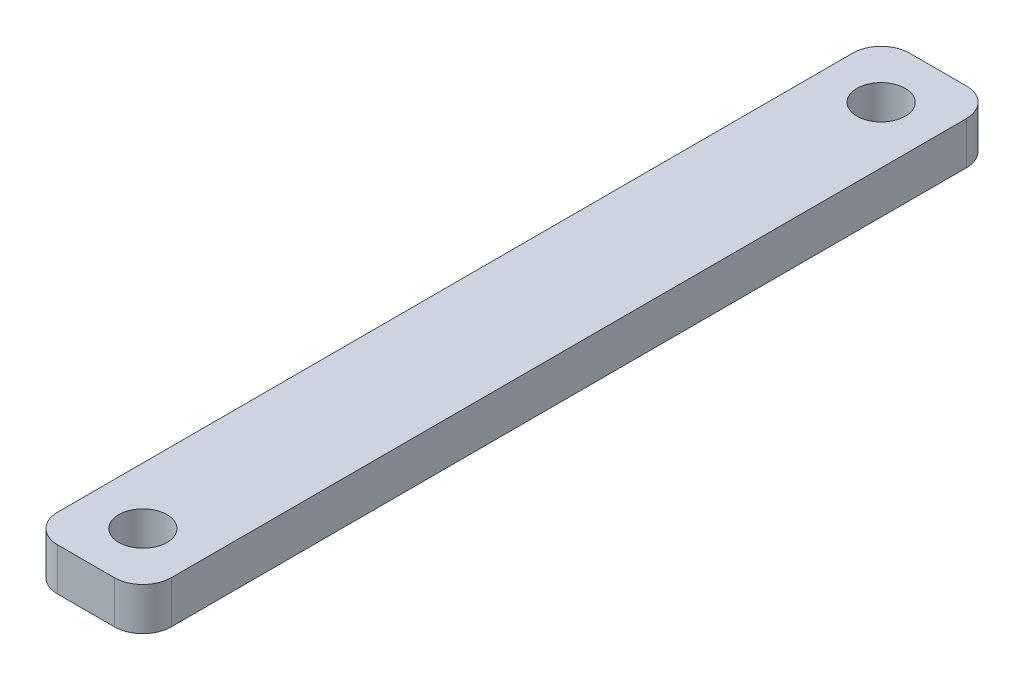
ISO-10303-21;
HEADER;
FILE_DESCRIPTION(('STEP AP214'),'2;1');
FILE_NAME('part.step','',(''),(''),'','','');
FILE_SCHEMA(('AUTOMOTIVE_DESIGN { 1 0 10303 214 1 1 1 1 }'));
ENDSEC;
DATA;
#1=APPLICATION_CONTEXT('core data for automotive mechanical design processes');
#2=APPLICATION_PROTOCOL_DEFINITION('international standard','automotive_design',2000,#1);
#3=PRODUCT_CONTEXT('',#1,'mechanical');
#4=PRODUCT('Part','Part','',(#3));
#5=PRODUCT_RELATED_PRODUCT_CATEGORY('part','',(#4));
#6=PRODUCT_DEFINITION_FORMATION('','',#4);
#7=PRODUCT_DEFINITION_CONTEXT('part definition',#1,'design');
#8=PRODUCT_DEFINITION('design','',#6,#7);
#9=PRODUCT_DEFINITION_SHAPE('','',#8);
#10=(LENGTH_UNIT() NAMED_UNIT(*) SI_UNIT(.MILLI.,.METRE.));
#11=(NAMED_UNIT(*) PLANE_ANGLE_UNIT() SI_UNIT($,.RADIAN.));
#12=(NAMED_UNIT(*) SI_UNIT($,.STERADIAN.) SOLID_ANGLE_UNIT());
#13=UNCERTAINTY_MEASURE_WITH_UNIT(LENGTH_MEASURE(1.E-05),#10,'distance_accuracy_value','');
#14=(GEOMETRIC_REPRESENTATION_CONTEXT(3) GLOBAL_UNCERTAINTY_ASSIGNED_CONTEXT((#13)) GLOBAL_UNIT_ASSIGNED_CONTEXT((#10,
#11,#12)) REPRESENTATION_CONTEXT('',''));
#15=CARTESIAN_POINT('',(0.,0.,0.));
#16=DIRECTION('',(0.,0.,1.));
#17=DIRECTION('',(1.,0.,0.));
#18=AXIS2_PLACEMENT_3D('',#15,#16,#17);
#19=CARTESIAN_POINT('',(2.00000000000001,3.,28.));
#20=DIRECTION('',(0.,1.,0.));
#21=DIRECTION('',(0.,0.,1.));
#22=AXIS2_PLACEMENT_3D('',#19,#20,#21);
#23=PLANE('',#22);
#24=CARTESIAN_POINT('',(0.,3.,-26.));
#25=DIRECTION('',(0.,1.,0.));
#26=DIRECTION('',(0.,0.,1.));
#27=AXIS2_PLACEMENT_3D('',#24,#25,#26);
#28=CIRCLE('',#27,1.7);
#29=CARTESIAN_POINT('',(0.,3.,-24.3));
#30=VERTEX_POINT('',#29);
#31=EDGE_CURVE('E134',#30,#30,#28,.T.);
#32=ORIENTED_EDGE('',*,*,#31,.F.);
#33=EDGE_LOOP('',(#32));
#34=FACE_BOUND('',#33,.T.);
#35=CARTESIAN_POINT('',(2.00000000000001,3.,28.));
#36=DIRECTION('',(0.,1.,0.));
#37=DIRECTION('',(0.,0.,1.));
#38=AXIS2_PLACEMENT_3D('',#35,#36,#37);
#39=CIRCLE('',#38,2.);
#40=CARTESIAN_POINT('',(2.00000000000001,3.,30.));
#41=VERTEX_POINT('',#40);
#42=CARTESIAN_POINT('',(4.00000000000001,3.,28.));
#43=VERTEX_POINT('',#42);
#44=EDGE_CURVE('E145',#41,#43,#39,.T.);
#45=ORIENTED_EDGE('',*,*,#44,.T.);
#46=DIRECTION('',(0.,0.,-1.));
#47=VECTOR('',#46,1.);
#48=CARTESIAN_POINT('',(4.00000000000001,3.,-28.));
#49=LINE('',#48,#47);
#50=CARTESIAN_POINT('',(4.00000000000001,3.,-28.));
#51=VERTEX_POINT('',#50);
#52=EDGE_CURVE('E93',#43,#51,#49,.T.);
#53=ORIENTED_EDGE('',*,*,#52,.T.);
#54=CARTESIAN_POINT('',(2.00000000000001,3.,-28.));
#55=DIRECTION('',(0.,1.,0.));
#56=DIRECTION('',(0.,0.,-1.));
#57=AXIS2_PLACEMENT_3D('',#54,#55,#56);
#58=CIRCLE('',#57,2.);
#59=CARTESIAN_POINT('',(2.00000000000001,3.,-30.));
#60=VERTEX_POINT('',#59);
#61=EDGE_CURVE('E160',#51,#60,#58,.T.);
#62=ORIENTED_EDGE('',*,*,#61,.T.);
#63=DIRECTION('',(-1.,0.,0.));
#64=VECTOR('',#63,1.);
#65=CARTESIAN_POINT('',(-2.00000000000001,3.,-30.));
#66=LINE('',#65,#64);
#67=CARTESIAN_POINT('',(-2.00000000000001,3.,-30.));
#68=VERTEX_POINT('',#67);
#69=EDGE_CURVE('E173',#60,#68,#66,.T.);
#70=ORIENTED_EDGE('',*,*,#69,.T.);
#71=CARTESIAN_POINT('',(-2.00000000000001,3.,-28.));
#72=DIRECTION('',(0.,1.,0.));
#73=DIRECTION('',(0.,0.,1.));
#74=AXIS2_PLACEMENT_3D('',#71,#72,#73);
#75=CIRCLE('',#74,2.);
#76=CARTESIAN_POINT('',(-4.00000000000001,3.,-28.));
#77=VERTEX_POINT('',#76);
#78=EDGE_CURVE('E112',#68,#77,#75,.T.);
#79=ORIENTED_EDGE('',*,*,#78,.T.);
#80=DIRECTION('',(0.,0.,1.));
#81=VECTOR('',#80,1.);
#82=CARTESIAN_POINT('',(-4.00000000000001,3.,-28.));
#83=LINE('',#82,#81);
#84=CARTESIAN_POINT('',(-4.,3.,28.));
#85=VERTEX_POINT('',#84);
#86=EDGE_CURVE('E106',#77,#85,#83,.T.);
#87=ORIENTED_EDGE('',*,*,#86,.T.);
#88=CARTESIAN_POINT('',(-2.,3.,28.));
#89=DIRECTION('',(0.,1.,0.));
#90=DIRECTION('',(0.,0.,1.));
#91=AXIS2_PLACEMENT_3D('',#88,#89,#90);
#92=CIRCLE('',#91,2.);
#93=CARTESIAN_POINT('',(-2.00000000000001,3.,30.));
#94=VERTEX_POINT('',#93);
#95=EDGE_CURVE('E110',#85,#94,#92,.T.);
#96=ORIENTED_EDGE('',*,*,#95,.T.);
#97=DIRECTION('',(1.,0.,0.));
#98=VECTOR('',#97,1.);
#99=CARTESIAN_POINT('',(-2.00000000000001,3.,30.));
#100=LINE('',#99,#98);
#101=EDGE_CURVE('E50',#94,#41,#100,.T.);
#102=ORIENTED_EDGE('',*,*,#101,.T.);
#103=EDGE_LOOP('',(#45,#53,#62,#70,#79,#87,#96,#102));
#104=FACE_BOUND('',#103,.T.);
#105=CARTESIAN_POINT('',(0.,3.,26.));
#106=DIRECTION('',(0.,1.,0.));
#107=DIRECTION('',(0.,0.,-1.));
#108=AXIS2_PLACEMENT_3D('',#105,#106,#107);
#109=CIRCLE('',#108,1.7);
#110=CARTESIAN_POINT('',(0.,3.,24.3));
#111=VERTEX_POINT('',#110);
#112=EDGE_CURVE('E182',#111,#111,#109,.T.);
#113=ORIENTED_EDGE('',*,*,#112,.F.);
#114=EDGE_LOOP('',(#113));
#115=FACE_BOUND('',#114,.T.);
#116=ADVANCED_FACE('F33',(#34,#104,#115),#23,.T.);
#117=CARTESIAN_POINT('',(2.00000000000001,0.,28.));
#118=DIRECTION('',(0.,1.,0.));
#119=DIRECTION('',(0.,0.,1.));
#120=AXIS2_PLACEMENT_3D('',#117,#118,#119);
#121=PLANE('',#120);
#122=CARTESIAN_POINT('',(2.00000000000001,0.,28.));
#123=DIRECTION('',(0.,1.,0.));
#124=DIRECTION('',(0.,0.,1.));
#125=AXIS2_PLACEMENT_3D('',#122,#123,#124);
#126=CIRCLE('',#125,2.);
#127=CARTESIAN_POINT('',(2.00000000000001,0.,30.));
#128=VERTEX_POINT('',#127);
#129=CARTESIAN_POINT('',(4.00000000000001,0.,28.));
#130=VERTEX_POINT('',#129);
#131=EDGE_CURVE('E130',#128,#130,#126,.T.);
#132=ORIENTED_EDGE('',*,*,#131,.F.);
#133=DIRECTION('',(1.,0.,0.));
#134=VECTOR('',#133,1.);
#135=CARTESIAN_POINT('',(-2.00000000000001,0.,30.));
#136=LINE('',#135,#134);
#137=CARTESIAN_POINT('',(-2.00000000000001,0.,30.));
#138=VERTEX_POINT('',#137);
#139=EDGE_CURVE('E85',#138,#128,#136,.T.);
#140=ORIENTED_EDGE('',*,*,#139,.F.);
#141=CARTESIAN_POINT('',(-2.,0.,28.));
#142=DIRECTION('',(0.,1.,0.));
#143=DIRECTION('',(0.,0.,1.));
#144=AXIS2_PLACEMENT_3D('',#141,#142,#143);
#145=CIRCLE('',#144,2.);
#146=CARTESIAN_POINT('',(-4.,0.,28.));
#147=VERTEX_POINT('',#146);
#148=EDGE_CURVE('E79',#147,#138,#145,.T.);
#149=ORIENTED_EDGE('',*,*,#148,.F.);
#150=DIRECTION('',(0.,0.,1.));
#151=VECTOR('',#150,1.);
#152=CARTESIAN_POINT('',(-4.00000000000001,0.,-28.));
#153=LINE('',#152,#151);
#154=CARTESIAN_POINT('',(-4.00000000000001,0.,-28.));
#155=VERTEX_POINT('',#154);
#156=EDGE_CURVE('E120',#155,#147,#153,.T.);
#157=ORIENTED_EDGE('',*,*,#156,.F.);
#158=CARTESIAN_POINT('',(-2.00000000000001,0.,-28.));
#159=DIRECTION('',(0.,1.,0.));
#160=DIRECTION('',(0.,0.,1.));
#161=AXIS2_PLACEMENT_3D('',#158,#159,#160);
#162=CIRCLE('',#161,2.);
#163=CARTESIAN_POINT('',(-2.00000000000001,0.,-30.));
#164=VERTEX_POINT('',#163);
#165=EDGE_CURVE('E140',#164,#155,#162,.T.);
#166=ORIENTED_EDGE('',*,*,#165,.F.);
#167=DIRECTION('',(-1.,0.,0.));
#168=VECTOR('',#167,1.);
#169=CARTESIAN_POINT('',(-2.00000000000001,0.,-30.));
#170=LINE('',#169,#168);
#171=CARTESIAN_POINT('',(2.00000000000001,0.,-30.));
#172=VERTEX_POINT('',#171);
#173=EDGE_CURVE('E138',#172,#164,#170,.T.);
#174=ORIENTED_EDGE('',*,*,#173,.F.);
#175=CARTESIAN_POINT('',(2.00000000000001,0.,-28.));
#176=DIRECTION('',(0.,1.,0.));
#177=DIRECTION('',(0.,0.,-1.));
#178=AXIS2_PLACEMENT_3D('',#175,#176,#177);
#179=CIRCLE('',#178,2.);
#180=CARTESIAN_POINT('',(4.00000000000001,0.,-28.));
#181=VERTEX_POINT('',#180);
#182=EDGE_CURVE('E136',#181,#172,#179,.T.);
#183=ORIENTED_EDGE('',*,*,#182,.F.);
#184=DIRECTION('',(0.,0.,-1.));
#185=VECTOR('',#184,1.);
#186=CARTESIAN_POINT('',(4.00000000000001,0.,-28.));
#187=LINE('',#186,#185);
#188=EDGE_CURVE('E133',#130,#181,#187,.T.);
#189=ORIENTED_EDGE('',*,*,#188,.F.);
#190=EDGE_LOOP('',(#132,#140,#149,#157,#166,#174,#183,#189));
#191=FACE_BOUND('',#190,.T.);
#192=CARTESIAN_POINT('',(0.,0.,-26.));
#193=DIRECTION('',(0.,1.,0.));
#194=DIRECTION('',(0.,0.,1.));
#195=AXIS2_PLACEMENT_3D('',#192,#193,#194);
#196=CIRCLE('',#195,1.7);
#197=CARTESIAN_POINT('',(0.,0.,-24.3));
#198=VERTEX_POINT('',#197);
#199=EDGE_CURVE('E179',#198,#198,#196,.T.);
#200=ORIENTED_EDGE('',*,*,#199,.T.);
#201=EDGE_LOOP('',(#200));
#202=FACE_BOUND('',#201,.T.);
#203=CARTESIAN_POINT('',(0.,0.,26.));
#204=DIRECTION('',(0.,1.,0.));
#205=DIRECTION('',(0.,0.,-1.));
#206=AXIS2_PLACEMENT_3D('',#203,#204,#205);
#207=CIRCLE('',#206,1.7);
#208=CARTESIAN_POINT('',(0.,0.,24.3));
#209=VERTEX_POINT('',#208);
#210=EDGE_CURVE('E185',#209,#209,#207,.T.);
#211=ORIENTED_EDGE('',*,*,#210,.T.);
#212=EDGE_LOOP('',(#211));
#213=FACE_BOUND('',#212,.T.);
#214=ADVANCED_FACE('F164',(#191,#202,#213),#121,.F.);
#215=CARTESIAN_POINT('',(2.00000000000001,3.,28.));
#216=DIRECTION('',(0.,-1.,0.));
#217=DIRECTION('',(0.,0.,-1.));
#218=AXIS2_PLACEMENT_3D('',#215,#216,#217);
#219=CYLINDRICAL_SURFACE('',#218,2.);
#220=ORIENTED_EDGE('',*,*,#131,.T.);
#221=DIRECTION('',(0.,-1.,0.));
#222=VECTOR('',#221,1.);
#223=CARTESIAN_POINT('',(4.00000000000001,3.,28.));
#224=LINE('',#223,#222);
#225=EDGE_CURVE('E11',#43,#130,#224,.T.);
#226=ORIENTED_EDGE('',*,*,#225,.F.);
#227=ORIENTED_EDGE('',*,*,#44,.F.);
#228=DIRECTION('',(0.,-1.,0.));
#229=VECTOR('',#228,1.);
#230=CARTESIAN_POINT('',(2.00000000000001,3.,30.));
#231=LINE('',#230,#229);
#232=EDGE_CURVE('E126',#41,#128,#231,.T.);
#233=ORIENTED_EDGE('',*,*,#232,.T.);
#234=EDGE_LOOP('',(#220,#226,#227,#233));
#235=FACE_BOUND('',#234,.T.);
#236=ADVANCED_FACE('F35',(#235),#219,.T.);
#237=CARTESIAN_POINT('',(4.00000000000001,3.,-28.));
#238=DIRECTION('',(-1.,0.,0.));
#239=DIRECTION('',(0.,0.,1.));
#240=AXIS2_PLACEMENT_3D('',#237,#238,#239);
#241=PLANE('',#240);
#242=ORIENTED_EDGE('',*,*,#188,.T.);
#243=DIRECTION('',(0.,-1.,0.));
#244=VECTOR('',#243,1.);
#245=CARTESIAN_POINT('',(4.00000000000001,3.,-28.));
#246=LINE('',#245,#244);
#247=EDGE_CURVE('E42',#51,#181,#246,.T.);
#248=ORIENTED_EDGE('',*,*,#247,.F.);
#249=ORIENTED_EDGE('',*,*,#52,.F.);
#250=ORIENTED_EDGE('',*,*,#225,.T.);
#251=EDGE_LOOP('',(#242,#248,#249,#250));
#252=FACE_BOUND('',#251,.T.);
#253=ADVANCED_FACE('F217',(#252),#241,.F.);
#254=CARTESIAN_POINT('',(2.00000000000001,3.,-28.));
#255=DIRECTION('',(0.,-1.,0.));
#256=DIRECTION('',(0.,0.,-1.));
#257=AXIS2_PLACEMENT_3D('',#254,#255,#256);
#258=CYLINDRICAL_SURFACE('',#257,2.);
#259=ORIENTED_EDGE('',*,*,#182,.T.);
#260=DIRECTION('',(0.,-1.,0.));
#261=VECTOR('',#260,1.);
#262=CARTESIAN_POINT('',(2.00000000000001,3.,-30.));
#263=LINE('',#262,#261);
#264=EDGE_CURVE('E152',#60,#172,#263,.T.);
#265=ORIENTED_EDGE('',*,*,#264,.F.);
#266=ORIENTED_EDGE('',*,*,#61,.F.);
#267=ORIENTED_EDGE('',*,*,#247,.T.);
#268=EDGE_LOOP('',(#259,#265,#266,#267));
#269=FACE_BOUND('',#268,.T.);
#270=ADVANCED_FACE('F158',(#269),#258,.T.);
#271=CARTESIAN_POINT('',(-2.00000000000001,3.,-30.));
#272=DIRECTION('',(0.,0.,1.));
#273=DIRECTION('',(1.,0.,0.));
#274=AXIS2_PLACEMENT_3D('',#271,#272,#273);
#275=PLANE('',#274);
#276=ORIENTED_EDGE('',*,*,#173,.T.);
#277=DIRECTION('',(0.,-1.,0.));
#278=VECTOR('',#277,1.);
#279=CARTESIAN_POINT('',(-2.00000000000001,3.,-30.));
#280=LINE('',#279,#278);
#281=EDGE_CURVE('E149',#68,#164,#280,.T.);
#282=ORIENTED_EDGE('',*,*,#281,.F.);
#283=ORIENTED_EDGE('',*,*,#69,.F.);
#284=ORIENTED_EDGE('',*,*,#264,.T.);
#285=EDGE_LOOP('',(#276,#282,#283,#284));
#286=FACE_BOUND('',#285,.T.);
#287=ADVANCED_FACE('F169',(#286),#275,.F.);
#288=CARTESIAN_POINT('',(-2.00000000000001,3.,-28.));
#289=DIRECTION('',(0.,-1.,0.));
#290=DIRECTION('',(0.,0.,-1.));
#291=AXIS2_PLACEMENT_3D('',#288,#289,#290);
#292=CYLINDRICAL_SURFACE('',#291,2.);
#293=ORIENTED_EDGE('',*,*,#165,.T.);
#294=DIRECTION('',(0.,-1.,0.));
#295=VECTOR('',#294,1.);
#296=CARTESIAN_POINT('',(-4.00000000000001,3.,-28.));
#297=LINE('',#296,#295);
#298=EDGE_CURVE('E121',#77,#155,#297,.T.);
#299=ORIENTED_EDGE('',*,*,#298,.F.);
#300=ORIENTED_EDGE('',*,*,#78,.F.);
#301=ORIENTED_EDGE('',*,*,#281,.T.);
#302=EDGE_LOOP('',(#293,#299,#300,#301));
#303=FACE_BOUND('',#302,.T.);
#304=ADVANCED_FACE('F172',(#303),#292,.T.);
#305=CARTESIAN_POINT('',(-4.00000000000001,3.,-28.));
#306=DIRECTION('',(1.,0.,0.));
#307=DIRECTION('',(0.,0.,-1.));
#308=AXIS2_PLACEMENT_3D('',#305,#306,#307);
#309=PLANE('',#308);
#310=ORIENTED_EDGE('',*,*,#156,.T.);
#311=DIRECTION('',(0.,-1.,0.));
#312=VECTOR('',#311,1.);
#313=CARTESIAN_POINT('',(-4.,3.,28.));
#314=LINE('',#313,#312);
#315=EDGE_CURVE('E117',#85,#147,#314,.T.);
#316=ORIENTED_EDGE('',*,*,#315,.F.);
#317=ORIENTED_EDGE('',*,*,#86,.F.);
#318=ORIENTED_EDGE('',*,*,#298,.T.);
#319=EDGE_LOOP('',(#310,#316,#317,#318));
#320=FACE_BOUND('',#319,.T.);
#321=ADVANCED_FACE('F118',(#320),#309,.F.);
#322=CARTESIAN_POINT('',(-2.,3.,28.));
#323=DIRECTION('',(0.,-1.,0.));
#324=DIRECTION('',(0.,0.,-1.));
#325=AXIS2_PLACEMENT_3D('',#322,#323,#324);
#326=CYLINDRICAL_SURFACE('',#325,2.);
#327=ORIENTED_EDGE('',*,*,#148,.T.);
#328=DIRECTION('',(0.,-1.,0.));
#329=VECTOR('',#328,1.);
#330=CARTESIAN_POINT('',(-2.00000000000001,3.,30.));
#331=LINE('',#330,#329);
#332=EDGE_CURVE('E122',#94,#138,#331,.T.);
#333=ORIENTED_EDGE('',*,*,#332,.F.);
#334=ORIENTED_EDGE('',*,*,#95,.F.);
#335=ORIENTED_EDGE('',*,*,#315,.T.);
#336=EDGE_LOOP('',(#327,#333,#334,#335));
#337=FACE_BOUND('',#336,.T.);
#338=ADVANCED_FACE('F124',(#337),#326,.T.);
#339=CARTESIAN_POINT('',(-2.00000000000001,3.,30.));
#340=DIRECTION('',(0.,0.,-1.));
#341=DIRECTION('',(-1.,0.,0.));
#342=AXIS2_PLACEMENT_3D('',#339,#340,#341);
#343=PLANE('',#342);
#344=ORIENTED_EDGE('',*,*,#139,.T.);
#345=ORIENTED_EDGE('',*,*,#232,.F.);
#346=ORIENTED_EDGE('',*,*,#101,.F.);
#347=ORIENTED_EDGE('',*,*,#332,.T.);
#348=EDGE_LOOP('',(#344,#345,#346,#347));
#349=FACE_BOUND('',#348,.T.);
#350=ADVANCED_FACE('F205',(#349),#343,.F.);
#351=CARTESIAN_POINT('',(0.,3.,-26.));
#352=DIRECTION('',(0.,-1.,0.));
#353=DIRECTION('',(0.,0.,-1.));
#354=AXIS2_PLACEMENT_3D('',#351,#352,#353);
#355=CYLINDRICAL_SURFACE('',#354,1.7);
#356=ORIENTED_EDGE('',*,*,#31,.T.);
#357=EDGE_LOOP('',(#356));
#358=FACE_BOUND('',#357,.T.);
#359=ORIENTED_EDGE('',*,*,#199,.F.);
#360=EDGE_LOOP('',(#359));
#361=FACE_BOUND('',#360,.T.);
#362=ADVANCED_FACE('F202',(#358,#361),#355,.F.);
#363=CARTESIAN_POINT('',(0.,3.,26.));
#364=DIRECTION('',(0.,-1.,0.));
#365=DIRECTION('',(0.,0.,-1.));
#366=AXIS2_PLACEMENT_3D('',#363,#364,#365);
#367=CYLINDRICAL_SURFACE('',#366,1.7);
#368=ORIENTED_EDGE('',*,*,#112,.T.);
#369=EDGE_LOOP('',(#368));
#370=FACE_BOUND('',#369,.T.);
#371=ORIENTED_EDGE('',*,*,#210,.F.);
#372=EDGE_LOOP('',(#371));
#373=FACE_BOUND('',#372,.T.);
#374=ADVANCED_FACE('F191',(#370,#373),#367,.F.);
#375=CLOSED_SHELL('',(#116,#214,#236,#253,#270,#287,#304,#321,#338,#350,#362,#374));
#376=MANIFOLD_SOLID_BREP('B2',#375);
#377=ADVANCED_BREP_SHAPE_REPRESENTATION('',(#18,#376),#14);
#378=SHAPE_DEFINITION_REPRESENTATION(#9,#377);
ENDSEC;
END-ISO-10303-21;
